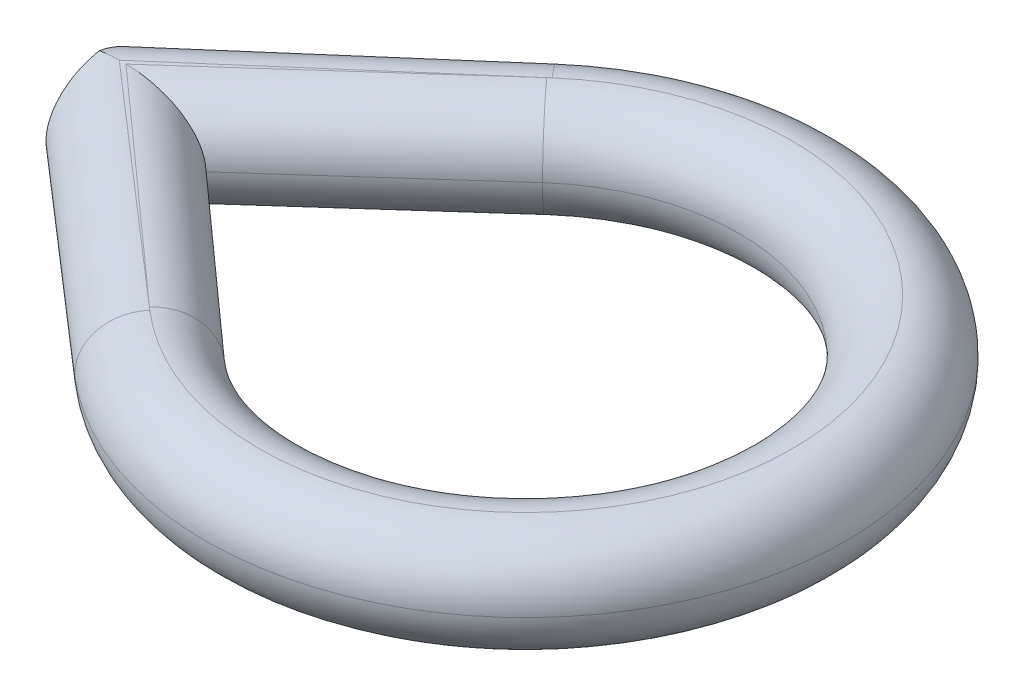
ISO-10303-21;
HEADER;
FILE_DESCRIPTION(('STEP AP214'),'2;1');
FILE_NAME('part.step','',(''),(''),'','','');
FILE_SCHEMA(('AUTOMOTIVE_DESIGN { 1 0 10303 214 1 1 1 1 }'));
ENDSEC;
DATA;
#1=APPLICATION_CONTEXT('core data for automotive mechanical design processes');
#2=APPLICATION_PROTOCOL_DEFINITION('international standard','automotive_design',2000,#1);
#3=PRODUCT_CONTEXT('',#1,'mechanical');
#4=PRODUCT('Part','Part','',(#3));
#5=PRODUCT_RELATED_PRODUCT_CATEGORY('part','',(#4));
#6=PRODUCT_DEFINITION_FORMATION('','',#4);
#7=PRODUCT_DEFINITION_CONTEXT('part definition',#1,'design');
#8=PRODUCT_DEFINITION('design','',#6,#7);
#9=PRODUCT_DEFINITION_SHAPE('','',#8);
#10=(LENGTH_UNIT() NAMED_UNIT(*) SI_UNIT(.MILLI.,.METRE.));
#11=(NAMED_UNIT(*) PLANE_ANGLE_UNIT() SI_UNIT($,.RADIAN.));
#12=(NAMED_UNIT(*) SI_UNIT($,.STERADIAN.) SOLID_ANGLE_UNIT());
#13=UNCERTAINTY_MEASURE_WITH_UNIT(LENGTH_MEASURE(1.E-05),#10,'distance_accuracy_value','');
#14=(GEOMETRIC_REPRESENTATION_CONTEXT(3) GLOBAL_UNCERTAINTY_ASSIGNED_CONTEXT((#13)) GLOBAL_UNIT_ASSIGNED_CONTEXT((#10,
#11,#12)) REPRESENTATION_CONTEXT('',''));
#15=CARTESIAN_POINT('',(0.,0.,0.));
#16=DIRECTION('',(0.,0.,1.));
#17=DIRECTION('',(1.,0.,0.));
#18=AXIS2_PLACEMENT_3D('',#15,#16,#17);
#19=CARTESIAN_POINT('',(-8.,-1.,0.));
#20=DIRECTION('',(1.,0.,0.));
#21=DIRECTION('',(0.,0.,-1.));
#22=AXIS2_PLACEMENT_3D('',#19,#20,#21);
#23=PLANE('',#22);
#24=CARTESIAN_POINT('',(-8.,0.,-0.324332802038426));
#25=DIRECTION('',(1.,0.,0.));
#26=DIRECTION('',(0.,0.,1.));
#27=AXIS2_PLACEMENT_3D('',#24,#25,#26);
#28=ELLIPSE('',#27,1.32433280203843,1.);
#29=CARTESIAN_POINT('',(-8.,0.,1.));
#30=VERTEX_POINT('',#29);
#31=CARTESIAN_POINT('',(-8.,0.969547637816958,0.));
#32=VERTEX_POINT('',#31);
#33=EDGE_CURVE('E202',#30,#32,#28,.F.);
#34=ORIENTED_EDGE('',*,*,#33,.T.);
#35=CARTESIAN_POINT('',(-8.,0.,0.324332802038431));
#36=DIRECTION('',(1.,0.,0.));
#37=DIRECTION('',(0.,0.,1.));
#38=AXIS2_PLACEMENT_3D('',#35,#36,#37);
#39=ELLIPSE('',#38,1.32433280203843,1.);
#40=CARTESIAN_POINT('',(-8.,0.,-0.999999999999999));
#41=VERTEX_POINT('',#40);
#42=EDGE_CURVE('E208',#32,#41,#39,.F.);
#43=ORIENTED_EDGE('',*,*,#42,.T.);
#44=CARTESIAN_POINT('',(-8.,0.,0.324332802038431));
#45=DIRECTION('',(1.,0.,0.));
#46=DIRECTION('',(0.,0.,-1.));
#47=AXIS2_PLACEMENT_3D('',#44,#45,#46);
#48=ELLIPSE('',#47,1.32433280203843,1.);
#49=CARTESIAN_POINT('',(-8.,-0.969547637816958,0.));
#50=VERTEX_POINT('',#49);
#51=EDGE_CURVE('E206',#41,#50,#48,.F.);
#52=ORIENTED_EDGE('',*,*,#51,.T.);
#53=CARTESIAN_POINT('',(-8.,0.,-0.324332802038427));
#54=DIRECTION('',(1.,0.,0.));
#55=DIRECTION('',(0.,0.,-1.));
#56=AXIS2_PLACEMENT_3D('',#53,#54,#55);
#57=ELLIPSE('',#56,1.32433280203843,1.);
#58=EDGE_CURVE('E204',#50,#30,#57,.F.);
#59=ORIENTED_EDGE('',*,*,#58,.T.);
#60=EDGE_LOOP('',(#34,#43,#52,#59));
#61=FACE_BOUND('',#60,.T.);
#62=ADVANCED_FACE('F34',(#61),#23,.F.);
#63=CARTESIAN_POINT('',(0.,-1.,0.));
#64=DIRECTION('',(0.,1.,0.));
#65=DIRECTION('',(0.,0.,1.));
#66=AXIS2_PLACEMENT_3D('',#63,#64,#65);
#67=PLANE('',#66);
#68=CARTESIAN_POINT('',(0.,-1.,0.));
#69=DIRECTION('',(0.,1.,0.));
#70=DIRECTION('',(0.,0.,1.));
#71=AXIS2_PLACEMENT_3D('',#68,#69,#70);
#72=CIRCLE('',#71,5.);
#73=CARTESIAN_POINT('',(-3.33333333333333,-1.,3.72677996249965));
#74=VERTEX_POINT('',#73);
#75=CARTESIAN_POINT('',(-3.27806424560504,-1.,3.7754860351597));
#76=VERTEX_POINT('',#75);
#77=EDGE_CURVE('E44',#74,#76,#72,.T.);
#78=ORIENTED_EDGE('',*,*,#77,.T.);
#79=DIRECTION('',(0.755097207031939,0.,0.655612849121007));
#80=VECTOR('',#79,1.);
#81=CARTESIAN_POINT('',(-7.34438715087899,-1.,0.244902792968062));
#82=LINE('',#81,#80);
#83=CARTESIAN_POINT('',(-7.62645211530493,-1.,0.));
#84=VERTEX_POINT('',#83);
#85=EDGE_CURVE('E11',#76,#84,#82,.F.);
#86=ORIENTED_EDGE('',*,*,#85,.T.);
#87=DIRECTION('',(0.755097207031939,0.,-0.655612849121008));
#88=VECTOR('',#87,1.);
#89=CARTESIAN_POINT('',(-3.27806424560504,-1.,-3.77548603515969));
#90=LINE('',#89,#88);
#91=CARTESIAN_POINT('',(-3.27806424560504,-1.,-3.77548603515969));
#92=VERTEX_POINT('',#91);
#93=EDGE_CURVE('E122',#84,#92,#90,.T.);
#94=ORIENTED_EDGE('',*,*,#93,.T.);
#95=CARTESIAN_POINT('',(0.,-1.,0.));
#96=DIRECTION('',(0.,1.,0.));
#97=DIRECTION('',(0.,0.,1.));
#98=AXIS2_PLACEMENT_3D('',#95,#96,#97);
#99=CIRCLE('',#98,5.);
#100=CARTESIAN_POINT('',(-3.33333333333333,-1.,-3.72677996249965));
#101=VERTEX_POINT('',#100);
#102=EDGE_CURVE('E123',#92,#101,#99,.T.);
#103=ORIENTED_EDGE('',*,*,#102,.T.);
#104=DIRECTION('',(0.74535599249993,0.,-0.666666666666667));
#105=VECTOR('',#104,1.);
#106=CARTESIAN_POINT('',(-6.66666666666667,-1.,-0.745355992499929));
#107=LINE('',#106,#105);
#108=CARTESIAN_POINT('',(-7.5,-1.,0.));
#109=VERTEX_POINT('',#108);
#110=EDGE_CURVE('E121',#101,#109,#107,.F.);
#111=ORIENTED_EDGE('',*,*,#110,.T.);
#112=DIRECTION('',(0.74535599249993,0.,0.666666666666667));
#113=VECTOR('',#112,1.);
#114=CARTESIAN_POINT('',(-3.33333333333333,-1.,3.72677996249965));
#115=LINE('',#114,#113);
#116=EDGE_CURVE('E118',#109,#74,#115,.T.);
#117=ORIENTED_EDGE('',*,*,#116,.T.);
#118=EDGE_LOOP('',(#78,#86,#94,#103,#111,#117));
#119=FACE_BOUND('',#118,.T.);
#120=ADVANCED_FACE('F119',(#119),#67,.F.);
#121=CARTESIAN_POINT('',(0.,1.,0.));
#122=DIRECTION('',(0.,1.,0.));
#123=DIRECTION('',(0.,0.,1.));
#124=AXIS2_PLACEMENT_3D('',#121,#122,#123);
#125=PLANE('',#124);
#126=DIRECTION('',(0.755097207031939,0.,-0.655612849121008));
#127=VECTOR('',#126,1.);
#128=CARTESIAN_POINT('',(-7.34438715087899,1.,-0.244902792968059));
#129=LINE('',#128,#127);
#130=CARTESIAN_POINT('',(-3.27806424560504,1.,-3.7754860351597));
#131=VERTEX_POINT('',#130);
#132=CARTESIAN_POINT('',(-7.62645211530493,1.,0.));
#133=VERTEX_POINT('',#132);
#134=EDGE_CURVE('E197',#131,#133,#129,.F.);
#135=ORIENTED_EDGE('',*,*,#134,.T.);
#136=DIRECTION('',(0.755097207031939,0.,0.655612849121007));
#137=VECTOR('',#136,1.);
#138=CARTESIAN_POINT('',(-3.27806424560504,1.,3.7754860351597));
#139=LINE('',#138,#137);
#140=CARTESIAN_POINT('',(-3.27806424560504,1.,3.7754860351597));
#141=VERTEX_POINT('',#140);
#142=EDGE_CURVE('E200',#133,#141,#139,.T.);
#143=ORIENTED_EDGE('',*,*,#142,.T.);
#144=CARTESIAN_POINT('',(0.,1.,0.));
#145=DIRECTION('',(0.,1.,0.));
#146=DIRECTION('',(0.,0.,1.));
#147=AXIS2_PLACEMENT_3D('',#144,#145,#146);
#148=CIRCLE('',#147,5.);
#149=CARTESIAN_POINT('',(-3.33333333333333,1.,3.72677996249965));
#150=VERTEX_POINT('',#149);
#151=EDGE_CURVE('E191',#141,#150,#148,.F.);
#152=ORIENTED_EDGE('',*,*,#151,.T.);
#153=DIRECTION('',(0.74535599249993,0.,0.666666666666667));
#154=VECTOR('',#153,1.);
#155=CARTESIAN_POINT('',(-6.66666666666667,1.,0.745355992499932));
#156=LINE('',#155,#154);
#157=CARTESIAN_POINT('',(-7.5,1.,0.));
#158=VERTEX_POINT('',#157);
#159=EDGE_CURVE('E83',#150,#158,#156,.F.);
#160=ORIENTED_EDGE('',*,*,#159,.T.);
#161=DIRECTION('',(0.74535599249993,0.,-0.666666666666667));
#162=VECTOR('',#161,1.);
#163=CARTESIAN_POINT('',(-3.33333333333333,1.,-3.72677996249965));
#164=LINE('',#163,#162);
#165=CARTESIAN_POINT('',(-3.33333333333333,1.,-3.72677996249965));
#166=VERTEX_POINT('',#165);
#167=EDGE_CURVE('E186',#158,#166,#164,.T.);
#168=ORIENTED_EDGE('',*,*,#167,.T.);
#169=CARTESIAN_POINT('',(0.,1.,0.));
#170=DIRECTION('',(0.,1.,0.));
#171=DIRECTION('',(0.,0.,1.));
#172=AXIS2_PLACEMENT_3D('',#169,#170,#171);
#173=CIRCLE('',#172,5.);
#174=EDGE_CURVE('E195',#166,#131,#173,.F.);
#175=ORIENTED_EDGE('',*,*,#174,.T.);
#176=EDGE_LOOP('',(#135,#143,#152,#160,#168,#175));
#177=FACE_BOUND('',#176,.T.);
#178=ADVANCED_FACE('F239',(#177),#125,.T.);
#179=CARTESIAN_POINT('',(-3.33333333333333,0.,3.72677996249965));
#180=DIRECTION('',(0.74535599249993,0.,0.666666666666667));
#181=DIRECTION('',(0.666666666666667,0.,-0.74535599249993));
#182=AXIS2_PLACEMENT_3D('',#179,#180,#181);
#183=CYLINDRICAL_SURFACE('',#182,1.);
#184=CARTESIAN_POINT('',(-3.33333333333333,0.,3.72677996249965));
#185=DIRECTION('',(0.74535599249993,0.,0.666666666666667));
#186=DIRECTION('',(0.666666666666667,0.,-0.74535599249993));
#187=AXIS2_PLACEMENT_3D('',#184,#185,#186);
#188=CIRCLE('',#187,1.);
#189=CARTESIAN_POINT('',(-2.66666666666667,0.,2.98142396999972));
#190=VERTEX_POINT('',#189);
#191=EDGE_CURVE('E125',#74,#190,#188,.T.);
#192=ORIENTED_EDGE('',*,*,#191,.F.);
#193=ORIENTED_EDGE('',*,*,#116,.F.);
#194=CARTESIAN_POINT('',(-7.5,0.,0.));
#195=DIRECTION('',(0.,0.,1.));
#196=DIRECTION('',(1.,0.,0.));
#197=AXIS2_PLACEMENT_3D('',#194,#195,#196);
#198=ELLIPSE('',#197,1.5,1.);
#199=CARTESIAN_POINT('',(-6.,0.,0.));
#200=VERTEX_POINT('',#199);
#201=EDGE_CURVE('E38',#200,#109,#198,.F.);
#202=ORIENTED_EDGE('',*,*,#201,.F.);
#203=DIRECTION('',(0.74535599249993,0.,0.666666666666667));
#204=VECTOR('',#203,1.);
#205=CARTESIAN_POINT('',(-2.66666666666667,0.,2.98142396999972));
#206=LINE('',#205,#204);
#207=EDGE_CURVE('E71',#190,#200,#206,.F.);
#208=ORIENTED_EDGE('',*,*,#207,.F.);
#209=EDGE_LOOP('',(#192,#193,#202,#208));
#210=FACE_BOUND('',#209,.T.);
#211=ADVANCED_FACE('F36',(#210),#183,.T.);
#212=CARTESIAN_POINT('',(-3.33333333333333,0.,-3.72677996249965));
#213=DIRECTION('',(-0.74535599249993,0.,0.666666666666667));
#214=DIRECTION('',(0.666666666666667,0.,0.74535599249993));
#215=AXIS2_PLACEMENT_3D('',#212,#213,#214);
#216=CYLINDRICAL_SURFACE('',#215,1.);
#217=ORIENTED_EDGE('',*,*,#201,.T.);
#218=ORIENTED_EDGE('',*,*,#110,.F.);
#219=CARTESIAN_POINT('',(-3.33333333333333,0.,-3.72677996249965));
#220=DIRECTION('',(0.74535599249993,0.,-0.666666666666667));
#221=DIRECTION('',(-0.666666666666667,0.,-0.74535599249993));
#222=AXIS2_PLACEMENT_3D('',#219,#220,#221);
#223=CIRCLE('',#222,1.);
#224=CARTESIAN_POINT('',(-2.66666666666667,0.,-2.98142396999972));
#225=VERTEX_POINT('',#224);
#226=EDGE_CURVE('E129',#225,#101,#223,.T.);
#227=ORIENTED_EDGE('',*,*,#226,.F.);
#228=DIRECTION('',(0.74535599249993,0.,-0.666666666666667));
#229=VECTOR('',#228,1.);
#230=CARTESIAN_POINT('',(-2.66666666666667,0.,-2.98142396999972));
#231=LINE('',#230,#229);
#232=EDGE_CURVE('E180',#200,#225,#231,.T.);
#233=ORIENTED_EDGE('',*,*,#232,.F.);
#234=EDGE_LOOP('',(#217,#218,#227,#233));
#235=FACE_BOUND('',#234,.T.);
#236=ADVANCED_FACE('F213',(#235),#216,.T.);
#237=CARTESIAN_POINT('',(-3.33333333333333,0.,3.72677996249965));
#238=DIRECTION('',(-0.74535599249993,0.,-0.666666666666667));
#239=DIRECTION('',(-0.666666666666667,0.,0.74535599249993));
#240=AXIS2_PLACEMENT_3D('',#237,#238,#239);
#241=CYLINDRICAL_SURFACE('',#240,1.);
#242=CARTESIAN_POINT('',(-3.33333333333333,0.,3.72677996249965));
#243=DIRECTION('',(0.74535599249993,0.,0.666666666666667));
#244=DIRECTION('',(0.666666666666667,0.,-0.74535599249993));
#245=AXIS2_PLACEMENT_3D('',#242,#243,#244);
#246=CIRCLE('',#245,1.);
#247=EDGE_CURVE('E171',#190,#150,#246,.T.);
#248=ORIENTED_EDGE('',*,*,#247,.F.);
#249=ORIENTED_EDGE('',*,*,#207,.T.);
#250=CARTESIAN_POINT('',(-7.5,0.,0.));
#251=DIRECTION('',(0.,0.,-1.));
#252=DIRECTION('',(-1.,0.,0.));
#253=AXIS2_PLACEMENT_3D('',#250,#251,#252);
#254=ELLIPSE('',#253,1.5,1.);
#255=EDGE_CURVE('E177',#158,#200,#254,.T.);
#256=ORIENTED_EDGE('',*,*,#255,.F.);
#257=ORIENTED_EDGE('',*,*,#159,.F.);
#258=EDGE_LOOP('',(#248,#249,#256,#257));
#259=FACE_BOUND('',#258,.T.);
#260=ADVANCED_FACE('F220',(#259),#241,.T.);
#261=CARTESIAN_POINT('',(0.,0.,0.));
#262=DIRECTION('',(0.,1.,0.));
#263=DIRECTION('',(0.,0.,1.));
#264=AXIS2_PLACEMENT_3D('',#261,#262,#263);
#265=TOROIDAL_SURFACE('',#264,5.,1.);
#266=ORIENTED_EDGE('',*,*,#77,.F.);
#267=ORIENTED_EDGE('',*,*,#191,.T.);
#268=CARTESIAN_POINT('',(0.,0.,0.));
#269=DIRECTION('',(0.,1.,0.));
#270=DIRECTION('',(0.,0.,1.));
#271=AXIS2_PLACEMENT_3D('',#268,#269,#270);
#272=CIRCLE('',#271,4.);
#273=EDGE_CURVE('E168',#225,#190,#272,.F.);
#274=ORIENTED_EDGE('',*,*,#273,.F.);
#275=ORIENTED_EDGE('',*,*,#226,.T.);
#276=ORIENTED_EDGE('',*,*,#102,.F.);
#277=CARTESIAN_POINT('',(0.,-1.,0.));
#278=DIRECTION('',(0.,1.,0.));
#279=DIRECTION('',(0.,0.,1.));
#280=AXIS2_PLACEMENT_3D('',#277,#278,#279);
#281=CIRCLE('',#280,5.);
#282=EDGE_CURVE('E135',#76,#92,#281,.T.);
#283=ORIENTED_EDGE('',*,*,#282,.F.);
#284=EDGE_LOOP('',(#266,#267,#274,#275,#276,#283));
#285=FACE_BOUND('',#284,.T.);
#286=ADVANCED_FACE('F132',(#285),#265,.T.);
#287=CARTESIAN_POINT('',(-3.27806424560504,0.,3.7754860351597));
#288=DIRECTION('',(-0.755097207031939,0.,-0.655612849121007));
#289=DIRECTION('',(-0.655612849121007,0.,0.755097207031939));
#290=AXIS2_PLACEMENT_3D('',#287,#288,#289);
#291=CYLINDRICAL_SURFACE('',#290,1.);
#292=CARTESIAN_POINT('',(-7.62645211530493,0.,0.));
#293=DIRECTION('',(0.,0.,-1.));
#294=DIRECTION('',(1.,0.,0.));
#295=AXIS2_PLACEMENT_3D('',#292,#293,#294);
#296=ELLIPSE('',#295,1.52529042306099,1.);
#297=EDGE_CURVE('E159',#84,#50,#296,.T.);
#298=ORIENTED_EDGE('',*,*,#297,.F.);
#299=ORIENTED_EDGE('',*,*,#85,.F.);
#300=CARTESIAN_POINT('',(-3.27806424560504,0.,3.7754860351597));
#301=DIRECTION('',(0.755097207031939,0.,0.655612849121008));
#302=DIRECTION('',(0.655612849121008,0.,-0.755097207031939));
#303=AXIS2_PLACEMENT_3D('',#300,#301,#302);
#304=CIRCLE('',#303,1.);
#305=CARTESIAN_POINT('',(-3.93367709472605,0.,4.53058324219163));
#306=VERTEX_POINT('',#305);
#307=EDGE_CURVE('E174',#306,#76,#304,.T.);
#308=ORIENTED_EDGE('',*,*,#307,.F.);
#309=DIRECTION('',(0.755097207031939,0.,0.655612849121007));
#310=VECTOR('',#309,1.);
#311=CARTESIAN_POINT('',(-3.93367709472605,0.,4.53058324219163));
#312=LINE('',#311,#310);
#313=EDGE_CURVE('E162',#30,#306,#312,.T.);
#314=ORIENTED_EDGE('',*,*,#313,.F.);
#315=ORIENTED_EDGE('',*,*,#58,.F.);
#316=EDGE_LOOP('',(#298,#299,#308,#314,#315));
#317=FACE_BOUND('',#316,.T.);
#318=ADVANCED_FACE('F269',(#317),#291,.T.);
#319=CARTESIAN_POINT('',(-3.33333333333333,0.,-3.72677996249965));
#320=DIRECTION('',(0.74535599249993,0.,-0.666666666666667));
#321=DIRECTION('',(-0.666666666666667,0.,-0.74535599249993));
#322=AXIS2_PLACEMENT_3D('',#319,#320,#321);
#323=CYLINDRICAL_SURFACE('',#322,1.);
#324=ORIENTED_EDGE('',*,*,#255,.T.);
#325=ORIENTED_EDGE('',*,*,#232,.T.);
#326=CARTESIAN_POINT('',(-3.33333333333333,0.,-3.72677996249965));
#327=DIRECTION('',(0.74535599249993,0.,-0.666666666666667));
#328=DIRECTION('',(-0.666666666666667,0.,-0.74535599249993));
#329=AXIS2_PLACEMENT_3D('',#326,#327,#328);
#330=CIRCLE('',#329,1.);
#331=EDGE_CURVE('E165',#166,#225,#330,.T.);
#332=ORIENTED_EDGE('',*,*,#331,.F.);
#333=ORIENTED_EDGE('',*,*,#167,.F.);
#334=EDGE_LOOP('',(#324,#325,#332,#333));
#335=FACE_BOUND('',#334,.T.);
#336=ADVANCED_FACE('F219',(#335),#323,.T.);
#337=CARTESIAN_POINT('',(0.,0.,0.));
#338=DIRECTION('',(0.,1.,0.));
#339=DIRECTION('',(0.,0.,1.));
#340=AXIS2_PLACEMENT_3D('',#337,#338,#339);
#341=TOROIDAL_SURFACE('',#340,5.,1.);
#342=ORIENTED_EDGE('',*,*,#247,.T.);
#343=ORIENTED_EDGE('',*,*,#151,.F.);
#344=CARTESIAN_POINT('',(0.,1.,0.));
#345=DIRECTION('',(0.,1.,0.));
#346=DIRECTION('',(0.,0.,1.));
#347=AXIS2_PLACEMENT_3D('',#344,#345,#346);
#348=CIRCLE('',#347,5.);
#349=EDGE_CURVE('E148',#131,#141,#348,.F.);
#350=ORIENTED_EDGE('',*,*,#349,.F.);
#351=ORIENTED_EDGE('',*,*,#174,.F.);
#352=ORIENTED_EDGE('',*,*,#331,.T.);
#353=ORIENTED_EDGE('',*,*,#273,.T.);
#354=EDGE_LOOP('',(#342,#343,#350,#351,#352,#353));
#355=FACE_BOUND('',#354,.T.);
#356=ADVANCED_FACE('F216',(#355),#341,.T.);
#357=CARTESIAN_POINT('',(0.,0.,0.));
#358=DIRECTION('',(0.,1.,0.));
#359=DIRECTION('',(0.,0.,1.));
#360=AXIS2_PLACEMENT_3D('',#357,#358,#359);
#361=TOROIDAL_SURFACE('',#360,5.,1.);
#362=ORIENTED_EDGE('',*,*,#307,.T.);
#363=ORIENTED_EDGE('',*,*,#282,.T.);
#364=CARTESIAN_POINT('',(-3.27806424560504,0.,-3.77548603515969));
#365=DIRECTION('',(-0.755097207031939,0.,0.655612849121008));
#366=DIRECTION('',(0.655612849121008,0.,0.755097207031939));
#367=AXIS2_PLACEMENT_3D('',#364,#365,#366);
#368=CIRCLE('',#367,1.);
#369=CARTESIAN_POINT('',(-3.93367709472605,0.,-4.53058324219163));
#370=VERTEX_POINT('',#369);
#371=EDGE_CURVE('E157',#370,#92,#368,.T.);
#372=ORIENTED_EDGE('',*,*,#371,.F.);
#373=CARTESIAN_POINT('',(0.,0.,0.));
#374=DIRECTION('',(0.,1.,0.));
#375=DIRECTION('',(0.,0.,1.));
#376=AXIS2_PLACEMENT_3D('',#373,#374,#375);
#377=CIRCLE('',#376,6.);
#378=EDGE_CURVE('E154',#306,#370,#377,.T.);
#379=ORIENTED_EDGE('',*,*,#378,.F.);
#380=EDGE_LOOP('',(#362,#363,#372,#379));
#381=FACE_BOUND('',#380,.T.);
#382=ADVANCED_FACE('F263',(#381),#361,.T.);
#383=CARTESIAN_POINT('',(-3.27806424560504,0.,3.7754860351597));
#384=DIRECTION('',(0.755097207031939,0.,0.655612849121007));
#385=DIRECTION('',(0.655612849121007,0.,-0.755097207031939));
#386=AXIS2_PLACEMENT_3D('',#383,#384,#385);
#387=CYLINDRICAL_SURFACE('',#386,1.);
#388=ORIENTED_EDGE('',*,*,#33,.F.);
#389=ORIENTED_EDGE('',*,*,#313,.T.);
#390=CARTESIAN_POINT('',(-3.27806424560504,0.,3.7754860351597));
#391=DIRECTION('',(0.755097207031939,0.,0.655612849121008));
#392=DIRECTION('',(0.655612849121008,0.,-0.755097207031939));
#393=AXIS2_PLACEMENT_3D('',#390,#391,#392);
#394=CIRCLE('',#393,1.);
#395=EDGE_CURVE('E151',#141,#306,#394,.T.);
#396=ORIENTED_EDGE('',*,*,#395,.F.);
#397=ORIENTED_EDGE('',*,*,#142,.F.);
#398=CARTESIAN_POINT('',(-7.62645211530493,0.,0.));
#399=DIRECTION('',(0.,0.,1.));
#400=DIRECTION('',(1.,0.,0.));
#401=AXIS2_PLACEMENT_3D('',#398,#399,#400);
#402=ELLIPSE('',#401,1.52529042306099,1.);
#403=EDGE_CURVE('E146',#32,#133,#402,.F.);
#404=ORIENTED_EDGE('',*,*,#403,.F.);
#405=EDGE_LOOP('',(#388,#389,#396,#397,#404));
#406=FACE_BOUND('',#405,.T.);
#407=ADVANCED_FACE('F227',(#406),#387,.T.);
#408=CARTESIAN_POINT('',(-3.27806424560504,0.,-3.77548603515969));
#409=DIRECTION('',(0.755097207031939,0.,-0.655612849121008));
#410=DIRECTION('',(-0.655612849121008,0.,-0.755097207031939));
#411=AXIS2_PLACEMENT_3D('',#408,#409,#410);
#412=CYLINDRICAL_SURFACE('',#411,1.);
#413=ORIENTED_EDGE('',*,*,#297,.T.);
#414=ORIENTED_EDGE('',*,*,#51,.F.);
#415=DIRECTION('',(0.755097207031939,0.,-0.655612849121008));
#416=VECTOR('',#415,1.);
#417=CARTESIAN_POINT('',(-3.93367709472605,0.,-4.53058324219163));
#418=LINE('',#417,#416);
#419=EDGE_CURVE('E144',#370,#41,#418,.F.);
#420=ORIENTED_EDGE('',*,*,#419,.F.);
#421=ORIENTED_EDGE('',*,*,#371,.T.);
#422=ORIENTED_EDGE('',*,*,#93,.F.);
#423=EDGE_LOOP('',(#413,#414,#420,#421,#422));
#424=FACE_BOUND('',#423,.T.);
#425=ADVANCED_FACE('F257',(#424),#412,.T.);
#426=CARTESIAN_POINT('',(0.,0.,0.));
#427=DIRECTION('',(0.,1.,0.));
#428=DIRECTION('',(0.,0.,1.));
#429=AXIS2_PLACEMENT_3D('',#426,#427,#428);
#430=TOROIDAL_SURFACE('',#429,5.,1.);
#431=ORIENTED_EDGE('',*,*,#395,.T.);
#432=ORIENTED_EDGE('',*,*,#378,.T.);
#433=CARTESIAN_POINT('',(-3.27806424560504,0.,-3.77548603515969));
#434=DIRECTION('',(-0.755097207031939,0.,0.655612849121008));
#435=DIRECTION('',(0.655612849121008,0.,0.755097207031939));
#436=AXIS2_PLACEMENT_3D('',#433,#434,#435);
#437=CIRCLE('',#436,1.);
#438=EDGE_CURVE('E141',#131,#370,#437,.T.);
#439=ORIENTED_EDGE('',*,*,#438,.F.);
#440=ORIENTED_EDGE('',*,*,#349,.T.);
#441=EDGE_LOOP('',(#431,#432,#439,#440));
#442=FACE_BOUND('',#441,.T.);
#443=ADVANCED_FACE('F233',(#442),#430,.T.);
#444=CARTESIAN_POINT('',(-3.27806424560504,0.,-3.77548603515969));
#445=DIRECTION('',(-0.755097207031939,0.,0.655612849121008));
#446=DIRECTION('',(0.655612849121008,0.,0.755097207031939));
#447=AXIS2_PLACEMENT_3D('',#444,#445,#446);
#448=CYLINDRICAL_SURFACE('',#447,1.);
#449=ORIENTED_EDGE('',*,*,#403,.T.);
#450=ORIENTED_EDGE('',*,*,#134,.F.);
#451=ORIENTED_EDGE('',*,*,#438,.T.);
#452=ORIENTED_EDGE('',*,*,#419,.T.);
#453=ORIENTED_EDGE('',*,*,#42,.F.);
#454=EDGE_LOOP('',(#449,#450,#451,#452,#453));
#455=FACE_BOUND('',#454,.T.);
#456=ADVANCED_FACE('F236',(#455),#448,.T.);
#457=CLOSED_SHELL('',(#62,#120,#178,#211,#236,#260,#286,#318,#336,#356,#382,#407,#425,#443,#456));
#458=MANIFOLD_SOLID_BREP('B2',#457);
#459=ADVANCED_BREP_SHAPE_REPRESENTATION('',(#18,#458),#14);
#460=SHAPE_DEFINITION_REPRESENTATION(#9,#459);
ENDSEC;
END-ISO-10303-21;
